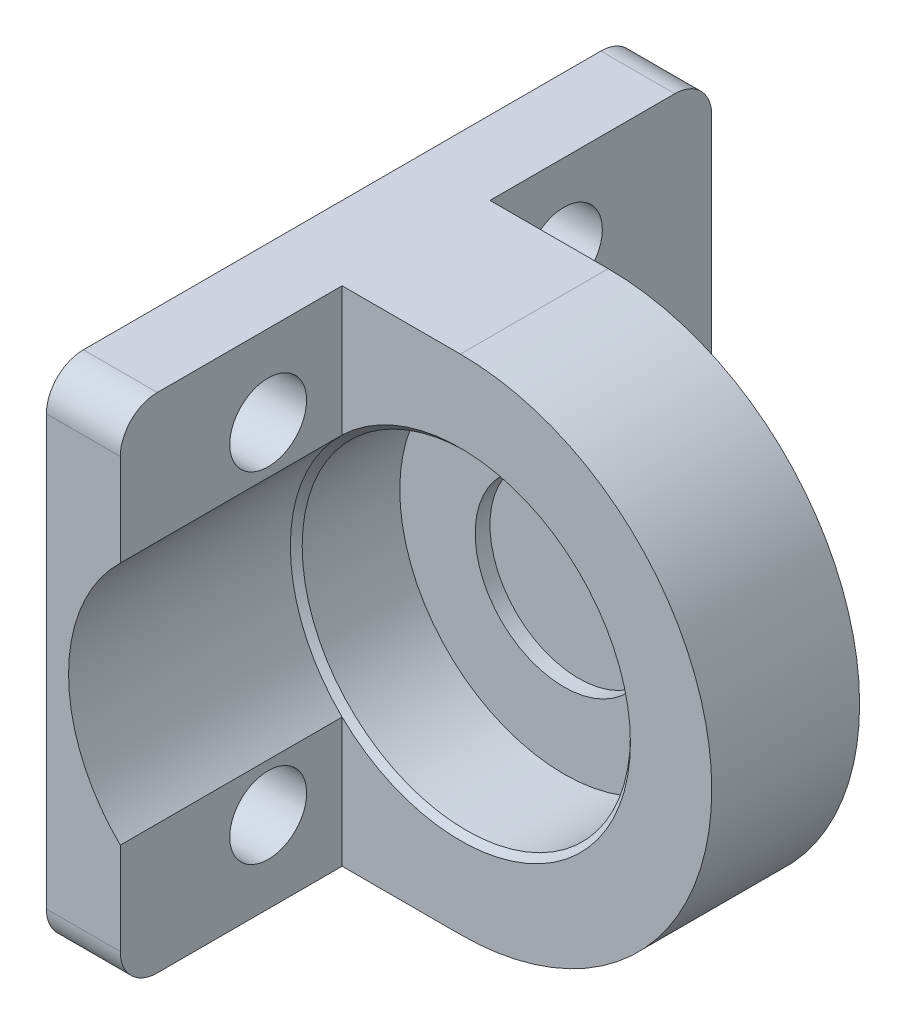
ISO-10303-21;
HEADER;
FILE_DESCRIPTION(('STEP AP214'),'2;1');
FILE_NAME('part.step','',(''),(''),'','','');
FILE_SCHEMA(('AUTOMOTIVE_DESIGN { 1 0 10303 214 1 1 1 1 }'));
ENDSEC;
DATA;
#1=APPLICATION_CONTEXT('core data for automotive mechanical design processes');
#2=APPLICATION_PROTOCOL_DEFINITION('international standard','automotive_design',2000,#1);
#3=PRODUCT_CONTEXT('',#1,'mechanical');
#4=PRODUCT('Part','Part','',(#3));
#5=PRODUCT_RELATED_PRODUCT_CATEGORY('part','',(#4));
#6=PRODUCT_DEFINITION_FORMATION('','',#4);
#7=PRODUCT_DEFINITION_CONTEXT('part definition',#1,'design');
#8=PRODUCT_DEFINITION('design','',#6,#7);
#9=PRODUCT_DEFINITION_SHAPE('','',#8);
#10=(LENGTH_UNIT() NAMED_UNIT(*) SI_UNIT(.MILLI.,.METRE.));
#11=(NAMED_UNIT(*) PLANE_ANGLE_UNIT() SI_UNIT($,.RADIAN.));
#12=(NAMED_UNIT(*) SI_UNIT($,.STERADIAN.) SOLID_ANGLE_UNIT());
#13=UNCERTAINTY_MEASURE_WITH_UNIT(LENGTH_MEASURE(1.E-05),#10,'distance_accuracy_value','');
#14=(GEOMETRIC_REPRESENTATION_CONTEXT(3) GLOBAL_UNCERTAINTY_ASSIGNED_CONTEXT((#13)) GLOBAL_UNIT_ASSIGNED_CONTEXT((#10,
#11,#12)) REPRESENTATION_CONTEXT('',''));
#15=CARTESIAN_POINT('',(0.,0.,0.));
#16=DIRECTION('',(0.,0.,1.));
#17=DIRECTION('',(1.,0.,0.));
#18=AXIS2_PLACEMENT_3D('',#15,#16,#17);
#19=CARTESIAN_POINT('',(-7.99999999999997,0.,0.));
#20=DIRECTION('',(1.,0.,0.));
#21=DIRECTION('',(0.,1.,0.));
#22=AXIS2_PLACEMENT_3D('',#19,#20,#21);
#23=PLANE('',#22);
#24=CARTESIAN_POINT('',(-7.99999999999997,-11.5,15.));
#25=DIRECTION('',(1.,0.,0.));
#26=DIRECTION('',(0.,1.,0.));
#27=AXIS2_PLACEMENT_3D('',#24,#25,#26);
#28=CIRCLE('',#27,2.59999999999999);
#29=CARTESIAN_POINT('',(-7.99999999999997,-8.90000000000001,15.));
#30=VERTEX_POINT('',#29);
#31=EDGE_CURVE('E261',#30,#30,#28,.T.);
#32=ORIENTED_EDGE('',*,*,#31,.F.);
#33=EDGE_LOOP('',(#32));
#34=FACE_BOUND('',#33,.T.);
#35=DIRECTION('',(0.,1.,0.));
#36=VECTOR('',#35,1.);
#37=CARTESIAN_POINT('',(-7.99999999999997,17.,25.));
#38=LINE('',#37,#36);
#39=CARTESIAN_POINT('',(-7.99999999999997,-14.5,25.));
#40=VERTEX_POINT('',#39);
#41=CARTESIAN_POINT('',(-7.99999999999997,-8.26135582092917,25.));
#42=VERTEX_POINT('',#41);
#43=EDGE_CURVE('E256',#40,#42,#38,.T.);
#44=ORIENTED_EDGE('',*,*,#43,.F.);
#45=CARTESIAN_POINT('',(-7.99999999999997,-14.5,22.5));
#46=DIRECTION('',(1.,0.,0.));
#47=DIRECTION('',(0.,1.,0.));
#48=AXIS2_PLACEMENT_3D('',#45,#46,#47);
#49=CIRCLE('',#48,2.5);
#50=CARTESIAN_POINT('',(-7.99999999999997,-17.,22.5));
#51=VERTEX_POINT('',#50);
#52=EDGE_CURVE('E11',#40,#51,#49,.T.);
#53=ORIENTED_EDGE('',*,*,#52,.T.);
#54=DIRECTION('',(0.,0.,1.));
#55=VECTOR('',#54,1.);
#56=CARTESIAN_POINT('',(-7.99999999999997,-17.,25.));
#57=LINE('',#56,#55);
#58=CARTESIAN_POINT('',(-7.99999999999997,-17.,10.));
#59=VERTEX_POINT('',#58);
#60=EDGE_CURVE('E171',#59,#51,#57,.T.);
#61=ORIENTED_EDGE('',*,*,#60,.F.);
#62=DIRECTION('',(0.,1.,0.));
#63=VECTOR('',#62,1.);
#64=CARTESIAN_POINT('',(-7.99999999999997,0.,10.));
#65=LINE('',#64,#63);
#66=CARTESIAN_POINT('',(-7.99999999999997,-8.26135582092917,10.));
#67=VERTEX_POINT('',#66);
#68=EDGE_CURVE('E167',#59,#67,#65,.T.);
#69=ORIENTED_EDGE('',*,*,#68,.T.);
#70=DIRECTION('',(0.,0.,-1.));
#71=VECTOR('',#70,1.);
#72=CARTESIAN_POINT('',(-7.99999999999997,-8.26135582092917,25.));
#73=LINE('',#72,#71);
#74=EDGE_CURVE('E153',#67,#42,#73,.F.);
#75=ORIENTED_EDGE('',*,*,#74,.T.);
#76=EDGE_LOOP('',(#44,#53,#61,#69,#75));
#77=FACE_BOUND('',#76,.T.);
#78=ADVANCED_FACE('F34',(#34,#77),#23,.T.);
#79=CARTESIAN_POINT('',(-7.99999999999997,11.5,15.));
#80=DIRECTION('',(1.,0.,0.));
#81=DIRECTION('',(0.,1.,0.));
#82=AXIS2_PLACEMENT_3D('',#79,#80,#81);
#83=CIRCLE('',#82,2.6);
#84=CARTESIAN_POINT('',(-7.99999999999997,14.1,15.));
#85=VERTEX_POINT('',#84);
#86=EDGE_CURVE('E268',#85,#85,#83,.T.);
#87=ORIENTED_EDGE('',*,*,#86,.F.);
#88=EDGE_LOOP('',(#87));
#89=FACE_BOUND('',#88,.T.);
#90=DIRECTION('',(0.,0.,-1.));
#91=VECTOR('',#90,1.);
#92=CARTESIAN_POINT('',(-7.99999999999997,17.,25.));
#93=LINE('',#92,#91);
#94=CARTESIAN_POINT('',(-7.99999999999997,17.,22.5));
#95=VERTEX_POINT('',#94);
#96=CARTESIAN_POINT('',(-7.99999999999997,17.,10.));
#97=VERTEX_POINT('',#96);
#98=EDGE_CURVE('E253',#95,#97,#93,.T.);
#99=ORIENTED_EDGE('',*,*,#98,.F.);
#100=CARTESIAN_POINT('',(-7.99999999999997,14.5,22.5));
#101=DIRECTION('',(1.,0.,0.));
#102=DIRECTION('',(0.,1.,0.));
#103=AXIS2_PLACEMENT_3D('',#100,#101,#102);
#104=CIRCLE('',#103,2.5);
#105=CARTESIAN_POINT('',(-7.99999999999997,14.5,25.));
#106=VERTEX_POINT('',#105);
#107=EDGE_CURVE('E42',#95,#106,#104,.T.);
#108=ORIENTED_EDGE('',*,*,#107,.T.);
#109=CARTESIAN_POINT('',(-7.99999999999997,8.26135582092917,25.));
#110=VERTEX_POINT('',#109);
#111=EDGE_CURVE('E161',#110,#106,#38,.T.);
#112=ORIENTED_EDGE('',*,*,#111,.F.);
#113=DIRECTION('',(0.,0.,-1.));
#114=VECTOR('',#113,1.);
#115=CARTESIAN_POINT('',(-7.99999999999997,8.26135582092917,25.));
#116=LINE('',#115,#114);
#117=CARTESIAN_POINT('',(-7.99999999999997,8.26135582092917,10.));
#118=VERTEX_POINT('',#117);
#119=EDGE_CURVE('E150',#110,#118,#116,.T.);
#120=ORIENTED_EDGE('',*,*,#119,.T.);
#121=EDGE_CURVE('E159',#118,#97,#65,.T.);
#122=ORIENTED_EDGE('',*,*,#121,.T.);
#123=EDGE_LOOP('',(#99,#108,#112,#120,#122));
#124=FACE_BOUND('',#123,.T.);
#125=ADVANCED_FACE('F158',(#89,#124),#23,.T.);
#126=CARTESIAN_POINT('',(0.,0.,10.));
#127=DIRECTION('',(0.,0.,-1.));
#128=DIRECTION('',(-1.,0.,0.));
#129=AXIS2_PLACEMENT_3D('',#126,#127,#128);
#130=CYLINDRICAL_SURFACE('',#129,17.);
#131=CARTESIAN_POINT('',(0.,0.,0.));
#132=DIRECTION('',(0.,0.,1.));
#133=DIRECTION('',(1.,0.,0.));
#134=AXIS2_PLACEMENT_3D('',#131,#132,#133);
#135=CIRCLE('',#134,17.);
#136=CARTESIAN_POINT('',(0.,-17.,0.));
#137=VERTEX_POINT('',#136);
#138=CARTESIAN_POINT('',(0.,17.,0.));
#139=VERTEX_POINT('',#138);
#140=EDGE_CURVE('E170',#137,#139,#135,.T.);
#141=ORIENTED_EDGE('',*,*,#140,.T.);
#142=DIRECTION('',(0.,0.,-1.));
#143=VECTOR('',#142,1.);
#144=CARTESIAN_POINT('',(0.,17.,10.));
#145=LINE('',#144,#143);
#146=CARTESIAN_POINT('',(0.,17.,10.));
#147=VERTEX_POINT('',#146);
#148=EDGE_CURVE('E198',#147,#139,#145,.T.);
#149=ORIENTED_EDGE('',*,*,#148,.F.);
#150=CARTESIAN_POINT('',(0.,0.,10.));
#151=DIRECTION('',(0.,0.,1.));
#152=DIRECTION('',(1.,0.,0.));
#153=AXIS2_PLACEMENT_3D('',#150,#151,#152);
#154=CIRCLE('',#153,17.);
#155=CARTESIAN_POINT('',(0.,-17.,10.));
#156=VERTEX_POINT('',#155);
#157=EDGE_CURVE('E177',#156,#147,#154,.T.);
#158=ORIENTED_EDGE('',*,*,#157,.F.);
#159=DIRECTION('',(0.,0.,-1.));
#160=VECTOR('',#159,1.);
#161=CARTESIAN_POINT('',(0.,-17.,10.));
#162=LINE('',#161,#160);
#163=EDGE_CURVE('E183',#156,#137,#162,.T.);
#164=ORIENTED_EDGE('',*,*,#163,.T.);
#165=EDGE_LOOP('',(#141,#149,#158,#164));
#166=FACE_BOUND('',#165,.T.);
#167=ADVANCED_FACE('F301',(#166),#130,.T.);
#168=CARTESIAN_POINT('',(0.,17.,10.));
#169=DIRECTION('',(0.,-1.,0.));
#170=DIRECTION('',(0.,0.,-1.));
#171=AXIS2_PLACEMENT_3D('',#168,#169,#170);
#172=PLANE('',#171);
#173=CARTESIAN_POINT('',(-7.99999999999997,17.,0.));
#174=VERTEX_POINT('',#173);
#175=CARTESIAN_POINT('',(-7.99999999999997,17.,-12.5));
#176=VERTEX_POINT('',#175);
#177=EDGE_CURVE('E255',#174,#176,#93,.T.);
#178=ORIENTED_EDGE('',*,*,#177,.T.);
#179=DIRECTION('',(-1.,0.,0.));
#180=VECTOR('',#179,1.);
#181=CARTESIAN_POINT('',(-13.,17.,-12.5));
#182=LINE('',#181,#180);
#183=CARTESIAN_POINT('',(-13.,17.,-12.5));
#184=VERTEX_POINT('',#183);
#185=EDGE_CURVE('E229',#176,#184,#182,.T.);
#186=ORIENTED_EDGE('',*,*,#185,.T.);
#187=DIRECTION('',(0.,0.,-1.));
#188=VECTOR('',#187,1.);
#189=CARTESIAN_POINT('',(-13.,17.,10.));
#190=LINE('',#189,#188);
#191=CARTESIAN_POINT('',(-13.,17.,22.5));
#192=VERTEX_POINT('',#191);
#193=EDGE_CURVE('E195',#192,#184,#190,.T.);
#194=ORIENTED_EDGE('',*,*,#193,.F.);
#195=DIRECTION('',(-1.,0.,0.));
#196=VECTOR('',#195,1.);
#197=CARTESIAN_POINT('',(-7.99999999999997,17.,22.5));
#198=LINE('',#197,#196);
#199=EDGE_CURVE('E227',#192,#95,#198,.F.);
#200=ORIENTED_EDGE('',*,*,#199,.T.);
#201=ORIENTED_EDGE('',*,*,#98,.T.);
#202=DIRECTION('',(-1.,0.,0.));
#203=VECTOR('',#202,1.);
#204=CARTESIAN_POINT('',(0.,17.,10.));
#205=LINE('',#204,#203);
#206=EDGE_CURVE('E166',#147,#97,#205,.T.);
#207=ORIENTED_EDGE('',*,*,#206,.F.);
#208=ORIENTED_EDGE('',*,*,#148,.T.);
#209=DIRECTION('',(-1.,0.,0.));
#210=VECTOR('',#209,1.);
#211=CARTESIAN_POINT('',(0.,17.,0.));
#212=LINE('',#211,#210);
#213=EDGE_CURVE('E186',#139,#174,#212,.T.);
#214=ORIENTED_EDGE('',*,*,#213,.T.);
#215=EDGE_LOOP('',(#178,#186,#194,#200,#201,#207,#208,#214));
#216=FACE_BOUND('',#215,.T.);
#217=ADVANCED_FACE('F304',(#216),#172,.F.);
#218=CARTESIAN_POINT('',(-13.,-17.,10.));
#219=DIRECTION('',(1.,0.,0.));
#220=DIRECTION('',(0.,0.,-1.));
#221=AXIS2_PLACEMENT_3D('',#218,#219,#220);
#222=PLANE('',#221);
#223=CARTESIAN_POINT('',(-13.,-11.5,15.));
#224=DIRECTION('',(1.,0.,0.));
#225=DIRECTION('',(0.,1.,0.));
#226=AXIS2_PLACEMENT_3D('',#223,#224,#225);
#227=CIRCLE('',#226,2.59999999999999);
#228=CARTESIAN_POINT('',(-13.,-8.90000000000001,15.));
#229=VERTEX_POINT('',#228);
#230=EDGE_CURVE('E264',#229,#229,#227,.T.);
#231=ORIENTED_EDGE('',*,*,#230,.T.);
#232=EDGE_LOOP('',(#231));
#233=FACE_BOUND('',#232,.T.);
#234=CARTESIAN_POINT('',(-13.,11.5,15.));
#235=DIRECTION('',(1.,0.,0.));
#236=DIRECTION('',(0.,1.,0.));
#237=AXIS2_PLACEMENT_3D('',#234,#235,#236);
#238=CIRCLE('',#237,2.6);
#239=CARTESIAN_POINT('',(-13.,14.1,15.));
#240=VERTEX_POINT('',#239);
#241=EDGE_CURVE('E271',#240,#240,#238,.T.);
#242=ORIENTED_EDGE('',*,*,#241,.T.);
#243=EDGE_LOOP('',(#242));
#244=FACE_BOUND('',#243,.T.);
#245=CARTESIAN_POINT('',(-13.,11.5,-5.));
#246=DIRECTION('',(1.,0.,0.));
#247=DIRECTION('',(0.,1.,0.));
#248=AXIS2_PLACEMENT_3D('',#245,#246,#247);
#249=CIRCLE('',#248,2.6);
#250=CARTESIAN_POINT('',(-13.,14.1,-5.));
#251=VERTEX_POINT('',#250);
#252=EDGE_CURVE('E259',#251,#251,#249,.T.);
#253=ORIENTED_EDGE('',*,*,#252,.T.);
#254=EDGE_LOOP('',(#253));
#255=FACE_BOUND('',#254,.T.);
#256=CARTESIAN_POINT('',(-13.,-11.5,-5.));
#257=DIRECTION('',(1.,0.,0.));
#258=DIRECTION('',(0.,1.,0.));
#259=AXIS2_PLACEMENT_3D('',#256,#257,#258);
#260=CIRCLE('',#259,2.6);
#261=CARTESIAN_POINT('',(-13.,-8.90000000000001,-5.));
#262=VERTEX_POINT('',#261);
#263=EDGE_CURVE('E245',#262,#262,#260,.T.);
#264=ORIENTED_EDGE('',*,*,#263,.T.);
#265=EDGE_LOOP('',(#264));
#266=FACE_BOUND('',#265,.T.);
#267=DIRECTION('',(0.,-1.,0.));
#268=VECTOR('',#267,1.);
#269=CARTESIAN_POINT('',(-13.,17.,-15.));
#270=LINE('',#269,#268);
#271=CARTESIAN_POINT('',(-13.,14.5,-15.));
#272=VERTEX_POINT('',#271);
#273=CARTESIAN_POINT('',(-13.,-14.5,-15.));
#274=VERTEX_POINT('',#273);
#275=EDGE_CURVE('E175',#272,#274,#270,.T.);
#276=ORIENTED_EDGE('',*,*,#275,.T.);
#277=CARTESIAN_POINT('',(-13.,-14.5,-12.5));
#278=DIRECTION('',(1.,0.,0.));
#279=DIRECTION('',(0.,0.,-1.));
#280=AXIS2_PLACEMENT_3D('',#277,#278,#279);
#281=CIRCLE('',#280,2.5);
#282=CARTESIAN_POINT('',(-13.,-17.,-12.5));
#283=VERTEX_POINT('',#282);
#284=EDGE_CURVE('E216',#274,#283,#281,.F.);
#285=ORIENTED_EDGE('',*,*,#284,.T.);
#286=DIRECTION('',(0.,0.,-1.));
#287=VECTOR('',#286,1.);
#288=CARTESIAN_POINT('',(-13.,-17.,10.));
#289=LINE('',#288,#287);
#290=CARTESIAN_POINT('',(-13.,-17.,22.5));
#291=VERTEX_POINT('',#290);
#292=EDGE_CURVE('E192',#291,#283,#289,.T.);
#293=ORIENTED_EDGE('',*,*,#292,.F.);
#294=CARTESIAN_POINT('',(-13.,-14.5,22.5));
#295=DIRECTION('',(1.,0.,0.));
#296=DIRECTION('',(0.,0.,-1.));
#297=AXIS2_PLACEMENT_3D('',#294,#295,#296);
#298=CIRCLE('',#297,2.5);
#299=CARTESIAN_POINT('',(-13.,-14.5,25.));
#300=VERTEX_POINT('',#299);
#301=EDGE_CURVE('E210',#291,#300,#298,.F.);
#302=ORIENTED_EDGE('',*,*,#301,.T.);
#303=DIRECTION('',(0.,1.,0.));
#304=VECTOR('',#303,1.);
#305=CARTESIAN_POINT('',(-13.,17.,25.));
#306=LINE('',#305,#304);
#307=CARTESIAN_POINT('',(-13.,14.5,25.));
#308=VERTEX_POINT('',#307);
#309=EDGE_CURVE('E238',#300,#308,#306,.T.);
#310=ORIENTED_EDGE('',*,*,#309,.T.);
#311=CARTESIAN_POINT('',(-13.,14.5,22.5));
#312=DIRECTION('',(1.,0.,0.));
#313=DIRECTION('',(0.,0.,-1.));
#314=AXIS2_PLACEMENT_3D('',#311,#312,#313);
#315=CIRCLE('',#314,2.5);
#316=EDGE_CURVE('E212',#308,#192,#315,.F.);
#317=ORIENTED_EDGE('',*,*,#316,.T.);
#318=ORIENTED_EDGE('',*,*,#193,.T.);
#319=CARTESIAN_POINT('',(-13.,14.5,-12.5));
#320=DIRECTION('',(1.,0.,0.));
#321=DIRECTION('',(0.,0.,-1.));
#322=AXIS2_PLACEMENT_3D('',#319,#320,#321);
#323=CIRCLE('',#322,2.5);
#324=EDGE_CURVE('E214',#184,#272,#323,.F.);
#325=ORIENTED_EDGE('',*,*,#324,.T.);
#326=EDGE_LOOP('',(#276,#285,#293,#302,#310,#317,#318,#325));
#327=FACE_BOUND('',#326,.T.);
#328=ADVANCED_FACE('F242',(#233,#244,#255,#266,#327),#222,.F.);
#329=CARTESIAN_POINT('',(0.,-17.,10.));
#330=DIRECTION('',(0.,1.,0.));
#331=DIRECTION('',(0.,0.,1.));
#332=AXIS2_PLACEMENT_3D('',#329,#330,#331);
#333=PLANE('',#332);
#334=ORIENTED_EDGE('',*,*,#292,.T.);
#335=DIRECTION('',(-1.,0.,0.));
#336=VECTOR('',#335,1.);
#337=CARTESIAN_POINT('',(-7.99999999999997,-17.,-12.5));
#338=LINE('',#337,#336);
#339=CARTESIAN_POINT('',(-7.99999999999997,-17.,-12.5));
#340=VERTEX_POINT('',#339);
#341=EDGE_CURVE('E221',#283,#340,#338,.F.);
#342=ORIENTED_EDGE('',*,*,#341,.T.);
#343=CARTESIAN_POINT('',(-7.99999999999997,-17.,0.));
#344=VERTEX_POINT('',#343);
#345=EDGE_CURVE('E168',#340,#344,#57,.T.);
#346=ORIENTED_EDGE('',*,*,#345,.T.);
#347=DIRECTION('',(1.,0.,0.));
#348=VECTOR('',#347,1.);
#349=CARTESIAN_POINT('',(0.,-17.,0.));
#350=LINE('',#349,#348);
#351=EDGE_CURVE('E179',#344,#137,#350,.T.);
#352=ORIENTED_EDGE('',*,*,#351,.T.);
#353=ORIENTED_EDGE('',*,*,#163,.F.);
#354=DIRECTION('',(1.,0.,0.));
#355=VECTOR('',#354,1.);
#356=CARTESIAN_POINT('',(0.,-17.,10.));
#357=LINE('',#356,#355);
#358=EDGE_CURVE('E181',#59,#156,#357,.T.);
#359=ORIENTED_EDGE('',*,*,#358,.F.);
#360=ORIENTED_EDGE('',*,*,#60,.T.);
#361=DIRECTION('',(-1.,0.,0.));
#362=VECTOR('',#361,1.);
#363=CARTESIAN_POINT('',(-13.,-17.,22.5));
#364=LINE('',#363,#362);
#365=EDGE_CURVE('E218',#51,#291,#364,.T.);
#366=ORIENTED_EDGE('',*,*,#365,.T.);
#367=EDGE_LOOP('',(#334,#342,#346,#352,#353,#359,#360,#366));
#368=FACE_BOUND('',#367,.T.);
#369=ADVANCED_FACE('F294',(#368),#333,.F.);
#370=CARTESIAN_POINT('',(0.,0.,10.));
#371=DIRECTION('',(0.,0.,1.));
#372=DIRECTION('',(1.,0.,0.));
#373=AXIS2_PLACEMENT_3D('',#370,#371,#372);
#374=PLANE('',#373);
#375=ORIENTED_EDGE('',*,*,#121,.F.);
#376=CARTESIAN_POINT('',(0.,0.,10.));
#377=DIRECTION('',(0.,0.,1.));
#378=DIRECTION('',(1.,0.,0.));
#379=AXIS2_PLACEMENT_3D('',#376,#377,#378);
#380=CIRCLE('',#379,11.5);
#381=EDGE_CURVE('E135',#118,#67,#380,.F.);
#382=ORIENTED_EDGE('',*,*,#381,.T.);
#383=ORIENTED_EDGE('',*,*,#68,.F.);
#384=ORIENTED_EDGE('',*,*,#358,.T.);
#385=ORIENTED_EDGE('',*,*,#157,.T.);
#386=ORIENTED_EDGE('',*,*,#206,.T.);
#387=EDGE_LOOP('',(#375,#382,#383,#384,#385,#386));
#388=FACE_BOUND('',#387,.T.);
#389=ADVANCED_FACE('F164',(#388),#374,.T.);
#390=CARTESIAN_POINT('',(0.,0.,0.));
#391=DIRECTION('',(0.,0.,1.));
#392=DIRECTION('',(1.,0.,0.));
#393=AXIS2_PLACEMENT_3D('',#390,#391,#392);
#394=PLANE('',#393);
#395=ORIENTED_EDGE('',*,*,#351,.F.);
#396=DIRECTION('',(0.,1.,0.));
#397=VECTOR('',#396,1.);
#398=CARTESIAN_POINT('',(-7.99999999999997,0.,0.));
#399=LINE('',#398,#397);
#400=EDGE_CURVE('E162',#344,#174,#399,.T.);
#401=ORIENTED_EDGE('',*,*,#400,.T.);
#402=ORIENTED_EDGE('',*,*,#213,.F.);
#403=ORIENTED_EDGE('',*,*,#140,.F.);
#404=EDGE_LOOP('',(#395,#401,#402,#403));
#405=FACE_BOUND('',#404,.T.);
#406=ADVANCED_FACE('F337',(#405),#394,.F.);
#407=CARTESIAN_POINT('',(-7.99999999999997,17.,-15.));
#408=DIRECTION('',(0.,0.,-1.));
#409=DIRECTION('',(0.,1.,0.));
#410=AXIS2_PLACEMENT_3D('',#407,#408,#409);
#411=PLANE('',#410);
#412=DIRECTION('',(0.,-1.,0.));
#413=VECTOR('',#412,1.);
#414=CARTESIAN_POINT('',(-7.99999999999997,17.,-15.));
#415=LINE('',#414,#413);
#416=CARTESIAN_POINT('',(-7.99999999999997,14.5,-15.));
#417=VERTEX_POINT('',#416);
#418=CARTESIAN_POINT('',(-7.99999999999997,-14.5,-15.));
#419=VERTEX_POINT('',#418);
#420=EDGE_CURVE('E250',#417,#419,#415,.T.);
#421=ORIENTED_EDGE('',*,*,#420,.T.);
#422=DIRECTION('',(-1.,0.,0.));
#423=VECTOR('',#422,1.);
#424=CARTESIAN_POINT('',(-13.,-14.5,-15.));
#425=LINE('',#424,#423);
#426=EDGE_CURVE('E207',#419,#274,#425,.T.);
#427=ORIENTED_EDGE('',*,*,#426,.T.);
#428=ORIENTED_EDGE('',*,*,#275,.F.);
#429=DIRECTION('',(-1.,0.,0.));
#430=VECTOR('',#429,1.);
#431=CARTESIAN_POINT('',(-7.99999999999997,14.5,-15.));
#432=LINE('',#431,#430);
#433=EDGE_CURVE('E143',#272,#417,#432,.F.);
#434=ORIENTED_EDGE('',*,*,#433,.T.);
#435=EDGE_LOOP('',(#421,#427,#428,#434));
#436=FACE_BOUND('',#435,.T.);
#437=ADVANCED_FACE('F329',(#436),#411,.T.);
#438=CARTESIAN_POINT('',(-7.99999999999997,11.5,-5.));
#439=DIRECTION('',(1.,0.,0.));
#440=DIRECTION('',(0.,1.,0.));
#441=AXIS2_PLACEMENT_3D('',#438,#439,#440);
#442=CIRCLE('',#441,2.6);
#443=CARTESIAN_POINT('',(-7.99999999999997,14.1,-5.));
#444=VERTEX_POINT('',#443);
#445=EDGE_CURVE('E274',#444,#444,#442,.T.);
#446=ORIENTED_EDGE('',*,*,#445,.F.);
#447=EDGE_LOOP('',(#446));
#448=FACE_BOUND('',#447,.T.);
#449=CARTESIAN_POINT('',(-7.99999999999997,-11.5,-5.));
#450=DIRECTION('',(1.,0.,0.));
#451=DIRECTION('',(0.,1.,0.));
#452=AXIS2_PLACEMENT_3D('',#449,#450,#451);
#453=CIRCLE('',#452,2.6);
#454=CARTESIAN_POINT('',(-7.99999999999997,-8.90000000000001,-5.));
#455=VERTEX_POINT('',#454);
#456=EDGE_CURVE('E247',#455,#455,#453,.T.);
#457=ORIENTED_EDGE('',*,*,#456,.F.);
#458=EDGE_LOOP('',(#457));
#459=FACE_BOUND('',#458,.T.);
#460=ORIENTED_EDGE('',*,*,#345,.F.);
#461=CARTESIAN_POINT('',(-7.99999999999997,-14.5,-12.5));
#462=DIRECTION('',(1.,0.,0.));
#463=DIRECTION('',(0.,1.,0.));
#464=AXIS2_PLACEMENT_3D('',#461,#462,#463);
#465=CIRCLE('',#464,2.5);
#466=EDGE_CURVE('E225',#340,#419,#465,.T.);
#467=ORIENTED_EDGE('',*,*,#466,.T.);
#468=ORIENTED_EDGE('',*,*,#420,.F.);
#469=CARTESIAN_POINT('',(-7.99999999999997,14.5,-12.5));
#470=DIRECTION('',(1.,0.,0.));
#471=DIRECTION('',(0.,1.,0.));
#472=AXIS2_PLACEMENT_3D('',#469,#470,#471);
#473=CIRCLE('',#472,2.5);
#474=EDGE_CURVE('E223',#417,#176,#473,.T.);
#475=ORIENTED_EDGE('',*,*,#474,.T.);
#476=ORIENTED_EDGE('',*,*,#177,.F.);
#477=ORIENTED_EDGE('',*,*,#400,.F.);
#478=EDGE_LOOP('',(#460,#467,#468,#475,#476,#477));
#479=FACE_BOUND('',#478,.T.);
#480=ADVANCED_FACE('F320',(#448,#459,#479),#23,.T.);
#481=CARTESIAN_POINT('',(-7.99999999999997,17.,25.));
#482=DIRECTION('',(0.,0.,1.));
#483=DIRECTION('',(0.,-1.,0.));
#484=AXIS2_PLACEMENT_3D('',#481,#482,#483);
#485=PLANE('',#484);
#486=ORIENTED_EDGE('',*,*,#111,.T.);
#487=DIRECTION('',(-1.,0.,0.));
#488=VECTOR('',#487,1.);
#489=CARTESIAN_POINT('',(-13.,14.5,25.));
#490=LINE('',#489,#488);
#491=EDGE_CURVE('E233',#106,#308,#490,.T.);
#492=ORIENTED_EDGE('',*,*,#491,.T.);
#493=ORIENTED_EDGE('',*,*,#309,.F.);
#494=DIRECTION('',(-1.,0.,0.));
#495=VECTOR('',#494,1.);
#496=CARTESIAN_POINT('',(-7.99999999999997,-14.5,25.));
#497=LINE('',#496,#495);
#498=EDGE_CURVE('E56',#300,#40,#497,.F.);
#499=ORIENTED_EDGE('',*,*,#498,.T.);
#500=ORIENTED_EDGE('',*,*,#43,.T.);
#501=CARTESIAN_POINT('',(0.,0.,25.));
#502=DIRECTION('',(0.,0.,1.));
#503=DIRECTION('',(1.,0.,0.));
#504=AXIS2_PLACEMENT_3D('',#501,#502,#503);
#505=CIRCLE('',#504,11.5);
#506=EDGE_CURVE('E155',#110,#42,#505,.T.);
#507=ORIENTED_EDGE('',*,*,#506,.F.);
#508=EDGE_LOOP('',(#486,#492,#493,#499,#500,#507));
#509=FACE_BOUND('',#508,.T.);
#510=ADVANCED_FACE('F237',(#509),#485,.T.);
#511=CARTESIAN_POINT('',(-13.,11.5,15.));
#512=DIRECTION('',(1.,0.,0.));
#513=DIRECTION('',(0.,1.,0.));
#514=AXIS2_PLACEMENT_3D('',#511,#512,#513);
#515=CYLINDRICAL_SURFACE('',#514,2.6);
#516=ORIENTED_EDGE('',*,*,#241,.F.);
#517=EDGE_LOOP('',(#516));
#518=FACE_BOUND('',#517,.T.);
#519=ORIENTED_EDGE('',*,*,#86,.T.);
#520=EDGE_LOOP('',(#519));
#521=FACE_BOUND('',#520,.T.);
#522=ADVANCED_FACE('F335',(#518,#521),#515,.F.);
#523=CARTESIAN_POINT('',(-13.,-11.5,15.));
#524=DIRECTION('',(1.,0.,0.));
#525=DIRECTION('',(0.,1.,0.));
#526=AXIS2_PLACEMENT_3D('',#523,#524,#525);
#527=CYLINDRICAL_SURFACE('',#526,2.59999999999999);
#528=ORIENTED_EDGE('',*,*,#230,.F.);
#529=EDGE_LOOP('',(#528));
#530=FACE_BOUND('',#529,.T.);
#531=ORIENTED_EDGE('',*,*,#31,.T.);
#532=EDGE_LOOP('',(#531));
#533=FACE_BOUND('',#532,.T.);
#534=ADVANCED_FACE('F482',(#530,#533),#527,.F.);
#535=CARTESIAN_POINT('',(-13.,-11.5,-5.));
#536=DIRECTION('',(1.,0.,0.));
#537=DIRECTION('',(0.,1.,0.));
#538=AXIS2_PLACEMENT_3D('',#535,#536,#537);
#539=CYLINDRICAL_SURFACE('',#538,2.6);
#540=ORIENTED_EDGE('',*,*,#263,.F.);
#541=EDGE_LOOP('',(#540));
#542=FACE_BOUND('',#541,.T.);
#543=ORIENTED_EDGE('',*,*,#456,.T.);
#544=EDGE_LOOP('',(#543));
#545=FACE_BOUND('',#544,.T.);
#546=ADVANCED_FACE('F473',(#542,#545),#539,.F.);
#547=CARTESIAN_POINT('',(-13.,11.5,-5.));
#548=DIRECTION('',(1.,0.,0.));
#549=DIRECTION('',(0.,1.,0.));
#550=AXIS2_PLACEMENT_3D('',#547,#548,#549);
#551=CYLINDRICAL_SURFACE('',#550,2.6);
#552=ORIENTED_EDGE('',*,*,#252,.F.);
#553=EDGE_LOOP('',(#552));
#554=FACE_BOUND('',#553,.T.);
#555=ORIENTED_EDGE('',*,*,#445,.T.);
#556=EDGE_LOOP('',(#555));
#557=FACE_BOUND('',#556,.T.);
#558=ADVANCED_FACE('F465',(#554,#557),#551,.F.);
#559=CARTESIAN_POINT('',(0.,0.,3.));
#560=DIRECTION('',(0.,0.,1.));
#561=DIRECTION('',(1.,0.,0.));
#562=AXIS2_PLACEMENT_3D('',#559,#560,#561);
#563=CYLINDRICAL_SURFACE('',#562,11.1);
#564=CARTESIAN_POINT('',(0.,0.,9.6));
#565=DIRECTION('',(0.,0.,1.));
#566=DIRECTION('',(1.,0.,0.));
#567=AXIS2_PLACEMENT_3D('',#564,#565,#566);
#568=CIRCLE('',#567,11.1);
#569=CARTESIAN_POINT('',(11.1,0.,9.6));
#570=VERTEX_POINT('',#569);
#571=EDGE_CURVE('E144',#570,#570,#568,.T.);
#572=ORIENTED_EDGE('',*,*,#571,.T.);
#573=EDGE_LOOP('',(#572));
#574=FACE_BOUND('',#573,.T.);
#575=CARTESIAN_POINT('',(0.,0.,3.));
#576=DIRECTION('',(0.,0.,1.));
#577=DIRECTION('',(1.,0.,0.));
#578=AXIS2_PLACEMENT_3D('',#575,#576,#577);
#579=CIRCLE('',#578,11.1);
#580=CARTESIAN_POINT('',(11.1,0.,3.));
#581=VERTEX_POINT('',#580);
#582=EDGE_CURVE('E265',#581,#581,#579,.T.);
#583=ORIENTED_EDGE('',*,*,#582,.F.);
#584=EDGE_LOOP('',(#583));
#585=FACE_BOUND('',#584,.T.);
#586=ADVANCED_FACE('F456',(#574,#585),#563,.F.);
#587=CARTESIAN_POINT('',(0.,0.,3.));
#588=DIRECTION('',(0.,0.,1.));
#589=DIRECTION('',(1.,0.,0.));
#590=AXIS2_PLACEMENT_3D('',#587,#588,#589);
#591=PLANE('',#590);
#592=CARTESIAN_POINT('',(0.,0.,3.));
#593=DIRECTION('',(0.,0.,1.));
#594=DIRECTION('',(1.,0.,0.));
#595=AXIS2_PLACEMENT_3D('',#592,#593,#594);
#596=CIRCLE('',#595,6.);
#597=CARTESIAN_POINT('',(6.,0.,3.));
#598=VERTEX_POINT('',#597);
#599=EDGE_CURVE('E282',#598,#598,#596,.T.);
#600=ORIENTED_EDGE('',*,*,#599,.F.);
#601=EDGE_LOOP('',(#600));
#602=FACE_BOUND('',#601,.T.);
#603=ORIENTED_EDGE('',*,*,#582,.T.);
#604=EDGE_LOOP('',(#603));
#605=FACE_BOUND('',#604,.T.);
#606=ADVANCED_FACE('F447',(#602,#605),#591,.T.);
#607=CARTESIAN_POINT('',(0.,0.,2.));
#608=DIRECTION('',(0.,0.,1.));
#609=DIRECTION('',(1.,0.,0.));
#610=AXIS2_PLACEMENT_3D('',#607,#608,#609);
#611=CYLINDRICAL_SURFACE('',#610,6.);
#612=CARTESIAN_POINT('',(0.,0.,2.));
#613=DIRECTION('',(0.,0.,1.));
#614=DIRECTION('',(1.,0.,0.));
#615=AXIS2_PLACEMENT_3D('',#612,#613,#614);
#616=CIRCLE('',#615,6.);
#617=CARTESIAN_POINT('',(6.,0.,2.));
#618=VERTEX_POINT('',#617);
#619=EDGE_CURVE('E281',#618,#618,#616,.T.);
#620=ORIENTED_EDGE('',*,*,#619,.F.);
#621=EDGE_LOOP('',(#620));
#622=FACE_BOUND('',#621,.T.);
#623=ORIENTED_EDGE('',*,*,#599,.T.);
#624=EDGE_LOOP('',(#623));
#625=FACE_BOUND('',#624,.T.);
#626=ADVANCED_FACE('F438',(#622,#625),#611,.F.);
#627=CARTESIAN_POINT('',(0.,0.,2.));
#628=DIRECTION('',(0.,0.,1.));
#629=DIRECTION('',(1.,0.,0.));
#630=AXIS2_PLACEMENT_3D('',#627,#628,#629);
#631=PLANE('',#630);
#632=ORIENTED_EDGE('',*,*,#619,.T.);
#633=EDGE_LOOP('',(#632));
#634=FACE_BOUND('',#633,.T.);
#635=ADVANCED_FACE('F409',(#634),#631,.T.);
#636=CARTESIAN_POINT('',(0.,0.,25.));
#637=DIRECTION('',(0.,0.,-1.));
#638=DIRECTION('',(-1.,0.,0.));
#639=AXIS2_PLACEMENT_3D('',#636,#637,#638);
#640=CYLINDRICAL_SURFACE('',#639,11.5);
#641=CARTESIAN_POINT('',(0.,0.,10.));
#642=DIRECTION('',(0.,0.,1.));
#643=DIRECTION('',(1.,0.,0.));
#644=AXIS2_PLACEMENT_3D('',#641,#642,#643);
#645=CIRCLE('',#644,11.5);
#646=EDGE_CURVE('E139',#118,#67,#645,.T.);
#647=ORIENTED_EDGE('',*,*,#646,.F.);
#648=ORIENTED_EDGE('',*,*,#119,.F.);
#649=ORIENTED_EDGE('',*,*,#506,.T.);
#650=ORIENTED_EDGE('',*,*,#74,.F.);
#651=EDGE_LOOP('',(#647,#648,#649,#650));
#652=FACE_BOUND('',#651,.T.);
#653=ADVANCED_FACE('F148',(#652),#640,.F.);
#654=CARTESIAN_POINT('',(0.,0.,9.6));
#655=DIRECTION('',(0.,0.,1.));
#656=DIRECTION('',(1.,0.,0.));
#657=AXIS2_PLACEMENT_3D('',#654,#655,#656);
#658=CONICAL_SURFACE('',#657,11.1,0.78539816339745);
#659=ORIENTED_EDGE('',*,*,#381,.F.);
#660=ORIENTED_EDGE('',*,*,#646,.T.);
#661=EDGE_LOOP('',(#659,#660));
#662=FACE_BOUND('',#661,.T.);
#663=ORIENTED_EDGE('',*,*,#571,.F.);
#664=EDGE_LOOP('',(#663));
#665=FACE_BOUND('',#664,.T.);
#666=ADVANCED_FACE('F137',(#662,#665),#658,.F.);
#667=CARTESIAN_POINT('',(-7.99999999999997,-14.5,-12.5));
#668=DIRECTION('',(1.,0.,0.));
#669=DIRECTION('',(0.,0.,-1.));
#670=AXIS2_PLACEMENT_3D('',#667,#668,#669);
#671=CYLINDRICAL_SURFACE('',#670,2.5);
#672=ORIENTED_EDGE('',*,*,#466,.F.);
#673=ORIENTED_EDGE('',*,*,#341,.F.);
#674=ORIENTED_EDGE('',*,*,#284,.F.);
#675=ORIENTED_EDGE('',*,*,#426,.F.);
#676=EDGE_LOOP('',(#672,#673,#674,#675));
#677=FACE_BOUND('',#676,.T.);
#678=ADVANCED_FACE('F314',(#677),#671,.T.);
#679=CARTESIAN_POINT('',(0.,14.5,-12.5));
#680=DIRECTION('',(1.,0.,0.));
#681=DIRECTION('',(0.,0.,-1.));
#682=AXIS2_PLACEMENT_3D('',#679,#680,#681);
#683=CYLINDRICAL_SURFACE('',#682,2.5);
#684=ORIENTED_EDGE('',*,*,#474,.F.);
#685=ORIENTED_EDGE('',*,*,#433,.F.);
#686=ORIENTED_EDGE('',*,*,#324,.F.);
#687=ORIENTED_EDGE('',*,*,#185,.F.);
#688=EDGE_LOOP('',(#684,#685,#686,#687));
#689=FACE_BOUND('',#688,.T.);
#690=ADVANCED_FACE('F308',(#689),#683,.T.);
#691=CARTESIAN_POINT('',(-7.99999999999997,14.5,22.5));
#692=DIRECTION('',(1.,0.,0.));
#693=DIRECTION('',(0.,0.,-1.));
#694=AXIS2_PLACEMENT_3D('',#691,#692,#693);
#695=CYLINDRICAL_SURFACE('',#694,2.5);
#696=ORIENTED_EDGE('',*,*,#107,.F.);
#697=ORIENTED_EDGE('',*,*,#199,.F.);
#698=ORIENTED_EDGE('',*,*,#316,.F.);
#699=ORIENTED_EDGE('',*,*,#491,.F.);
#700=EDGE_LOOP('',(#696,#697,#698,#699));
#701=FACE_BOUND('',#700,.T.);
#702=ADVANCED_FACE('F306',(#701),#695,.T.);
#703=CARTESIAN_POINT('',(0.,-14.5,22.5));
#704=DIRECTION('',(1.,0.,0.));
#705=DIRECTION('',(0.,0.,-1.));
#706=AXIS2_PLACEMENT_3D('',#703,#704,#705);
#707=CYLINDRICAL_SURFACE('',#706,2.5);
#708=ORIENTED_EDGE('',*,*,#52,.F.);
#709=ORIENTED_EDGE('',*,*,#498,.F.);
#710=ORIENTED_EDGE('',*,*,#301,.F.);
#711=ORIENTED_EDGE('',*,*,#365,.F.);
#712=EDGE_LOOP('',(#708,#709,#710,#711));
#713=FACE_BOUND('',#712,.T.);
#714=ADVANCED_FACE('F36',(#713),#707,.T.);
#715=CLOSED_SHELL('',(#78,#125,#167,#217,#328,#369,#389,#406,#437,#480,#510,#522,#534,#546,#558,
#586,#606,#626,#635,#653,#666,#678,#690,#702,#714));
#716=MANIFOLD_SOLID_BREP('B2',#715);
#717=ADVANCED_BREP_SHAPE_REPRESENTATION('',(#18,#716),#14);
#718=SHAPE_DEFINITION_REPRESENTATION(#9,#717);
ENDSEC;
END-ISO-10303-21;
